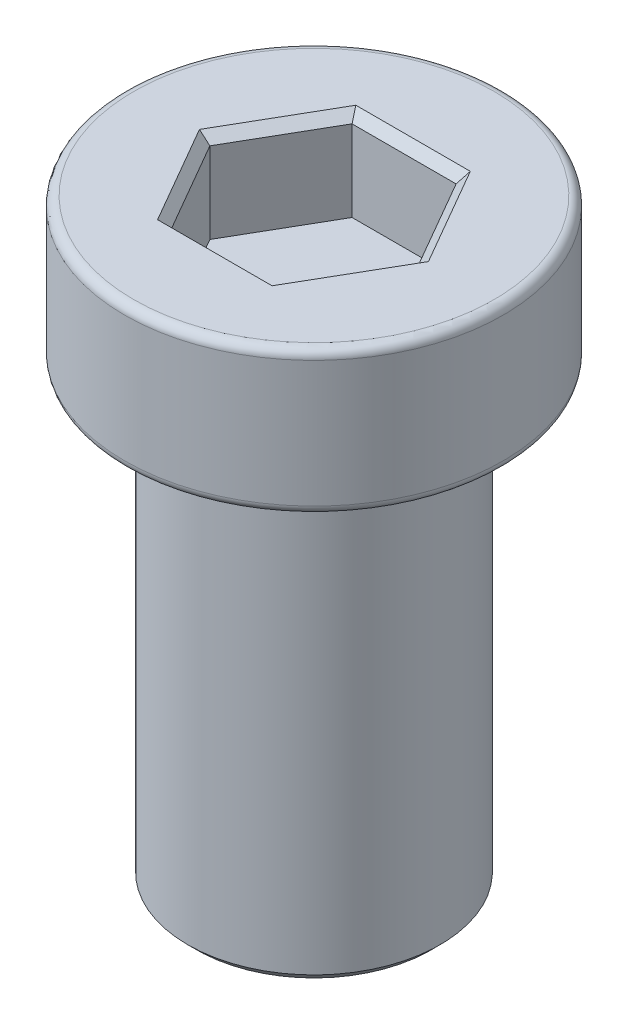
ISO-10303-21;
HEADER;
FILE_DESCRIPTION(('STEP AP214'),'2;1');
FILE_NAME('part.step','',(''),(''),'','','');
FILE_SCHEMA(('AUTOMOTIVE_DESIGN { 1 0 10303 214 1 1 1 1 }'));
ENDSEC;
DATA;
#1=APPLICATION_CONTEXT('core data for automotive mechanical design processes');
#2=APPLICATION_PROTOCOL_DEFINITION('international standard','automotive_design',2000,#1);
#3=PRODUCT_CONTEXT('',#1,'mechanical');
#4=PRODUCT('Part','Part','',(#3));
#5=PRODUCT_RELATED_PRODUCT_CATEGORY('part','',(#4));
#6=PRODUCT_DEFINITION_FORMATION('','',#4);
#7=PRODUCT_DEFINITION_CONTEXT('part definition',#1,'design');
#8=PRODUCT_DEFINITION('design','',#6,#7);
#9=PRODUCT_DEFINITION_SHAPE('','',#8);
#10=(LENGTH_UNIT() NAMED_UNIT(*) SI_UNIT(.MILLI.,.METRE.));
#11=(NAMED_UNIT(*) PLANE_ANGLE_UNIT() SI_UNIT($,.RADIAN.));
#12=(NAMED_UNIT(*) SI_UNIT($,.STERADIAN.) SOLID_ANGLE_UNIT());
#13=UNCERTAINTY_MEASURE_WITH_UNIT(LENGTH_MEASURE(1.E-05),#10,'distance_accuracy_value','');
#14=(GEOMETRIC_REPRESENTATION_CONTEXT(3) GLOBAL_UNCERTAINTY_ASSIGNED_CONTEXT((#13)) GLOBAL_UNIT_ASSIGNED_CONTEXT((#10,
#11,#12)) REPRESENTATION_CONTEXT('',''));
#15=CARTESIAN_POINT('',(0.,0.,0.));
#16=DIRECTION('',(0.,0.,1.));
#17=DIRECTION('',(1.,0.,0.));
#18=AXIS2_PLACEMENT_3D('',#15,#16,#17);
#19=CARTESIAN_POINT('',(0.,8.,0.));
#20=DIRECTION('',(0.,-1.,0.));
#21=DIRECTION('',(0.,0.,-1.));
#22=AXIS2_PLACEMENT_3D('',#19,#20,#21);
#23=CYLINDRICAL_SURFACE('',#22,10.5);
#24=CARTESIAN_POINT('',(0.,7.5,0.));
#25=DIRECTION('',(0.,1.,0.));
#26=DIRECTION('',(0.,0.,1.));
#27=AXIS2_PLACEMENT_3D('',#24,#25,#26);
#28=CIRCLE('',#27,10.5);
#29=CARTESIAN_POINT('',(0.,7.5,10.5));
#30=VERTEX_POINT('',#29);
#31=EDGE_CURVE('E176',#30,#30,#28,.F.);
#32=ORIENTED_EDGE('',*,*,#31,.T.);
#33=EDGE_LOOP('',(#32));
#34=FACE_BOUND('',#33,.T.);
#35=CARTESIAN_POINT('',(0.,0.5,0.));
#36=DIRECTION('',(0.,1.,0.));
#37=DIRECTION('',(0.,0.,1.));
#38=AXIS2_PLACEMENT_3D('',#35,#36,#37);
#39=CIRCLE('',#38,10.5);
#40=CARTESIAN_POINT('',(0.,0.5,10.5));
#41=VERTEX_POINT('',#40);
#42=EDGE_CURVE('E173',#41,#41,#39,.T.);
#43=ORIENTED_EDGE('',*,*,#42,.T.);
#44=EDGE_LOOP('',(#43));
#45=FACE_BOUND('',#44,.T.);
#46=ADVANCED_FACE('F43',(#34,#45),#23,.T.);
#47=CARTESIAN_POINT('',(0.,8.,0.));
#48=DIRECTION('',(0.,1.,0.));
#49=DIRECTION('',(0.,0.,1.));
#50=AXIS2_PLACEMENT_3D('',#47,#48,#49);
#51=PLANE('',#50);
#52=DIRECTION('',(0.5,0.,0.866025403784439));
#53=VECTOR('',#52,1.);
#54=CARTESIAN_POINT('',(6.20651539378847,8.,-0.25));
#55=LINE('',#54,#53);
#56=CARTESIAN_POINT('',(3.17542648054294,8.,-5.49999999999999));
#57=VERTEX_POINT('',#56);
#58=CARTESIAN_POINT('',(6.35085296108588,8.,0.));
#59=VERTEX_POINT('',#58);
#60=EDGE_CURVE('E187',#57,#59,#55,.T.);
#61=ORIENTED_EDGE('',*,*,#60,.T.);
#62=DIRECTION('',(-0.5,0.,0.866025403784439));
#63=VECTOR('',#62,1.);
#64=CARTESIAN_POINT('',(3.31976404784034,8.,5.25));
#65=LINE('',#64,#63);
#66=CARTESIAN_POINT('',(3.17542648054294,8.,5.49999999999999));
#67=VERTEX_POINT('',#66);
#68=EDGE_CURVE('E193',#59,#67,#65,.T.);
#69=ORIENTED_EDGE('',*,*,#68,.T.);
#70=DIRECTION('',(-1.,0.,0.));
#71=VECTOR('',#70,1.);
#72=CARTESIAN_POINT('',(-2.88675134594813,8.,5.49999999999999));
#73=LINE('',#72,#71);
#74=CARTESIAN_POINT('',(-3.17542648054294,8.,5.49999999999999));
#75=VERTEX_POINT('',#74);
#76=EDGE_CURVE('E191',#67,#75,#73,.T.);
#77=ORIENTED_EDGE('',*,*,#76,.T.);
#78=DIRECTION('',(-0.5,0.,-0.866025403784439));
#79=VECTOR('',#78,1.);
#80=CARTESIAN_POINT('',(-6.20651539378847,8.,0.249999999999998));
#81=LINE('',#80,#79);
#82=CARTESIAN_POINT('',(-6.35085296108588,8.,0.));
#83=VERTEX_POINT('',#82);
#84=EDGE_CURVE('E189',#75,#83,#81,.T.);
#85=ORIENTED_EDGE('',*,*,#84,.T.);
#86=DIRECTION('',(0.5,0.,-0.866025403784439));
#87=VECTOR('',#86,1.);
#88=CARTESIAN_POINT('',(-3.31976404784034,8.,-5.25));
#89=LINE('',#88,#87);
#90=CARTESIAN_POINT('',(-3.17542648054294,8.,-5.49999999999999));
#91=VERTEX_POINT('',#90);
#92=EDGE_CURVE('E183',#83,#91,#89,.T.);
#93=ORIENTED_EDGE('',*,*,#92,.T.);
#94=DIRECTION('',(1.,0.,0.));
#95=VECTOR('',#94,1.);
#96=CARTESIAN_POINT('',(2.88675134594813,8.,-5.49999999999999));
#97=LINE('',#96,#95);
#98=EDGE_CURVE('E185',#91,#57,#97,.T.);
#99=ORIENTED_EDGE('',*,*,#98,.T.);
#100=EDGE_LOOP('',(#61,#69,#77,#85,#93,#99));
#101=FACE_BOUND('',#100,.T.);
#102=CARTESIAN_POINT('',(0.,8.,0.));
#103=DIRECTION('',(0.,1.,0.));
#104=DIRECTION('',(0.,0.,1.));
#105=AXIS2_PLACEMENT_3D('',#102,#103,#104);
#106=CIRCLE('',#105,10.);
#107=CARTESIAN_POINT('',(0.,8.,10.));
#108=VERTEX_POINT('',#107);
#109=EDGE_CURVE('E170',#108,#108,#106,.T.);
#110=ORIENTED_EDGE('',*,*,#109,.T.);
#111=EDGE_LOOP('',(#110));
#112=FACE_BOUND('',#111,.T.);
#113=ADVANCED_FACE('F238',(#101,#112),#51,.T.);
#114=CARTESIAN_POINT('',(0.,0.,0.));
#115=DIRECTION('',(0.,1.,0.));
#116=DIRECTION('',(0.,0.,1.));
#117=AXIS2_PLACEMENT_3D('',#114,#115,#116);
#118=PLANE('',#117);
#119=CARTESIAN_POINT('',(0.,0.,0.));
#120=DIRECTION('',(0.,1.,0.));
#121=DIRECTION('',(0.,0.,1.));
#122=AXIS2_PLACEMENT_3D('',#119,#120,#121);
#123=CIRCLE('',#122,10.);
#124=CARTESIAN_POINT('',(0.,0.,10.));
#125=VERTEX_POINT('',#124);
#126=EDGE_CURVE('E179',#125,#125,#123,.F.);
#127=ORIENTED_EDGE('',*,*,#126,.T.);
#128=EDGE_LOOP('',(#127));
#129=FACE_BOUND('',#128,.T.);
#130=CARTESIAN_POINT('',(0.,0.,0.));
#131=DIRECTION('',(0.,-1.,0.));
#132=DIRECTION('',(0.,0.,-1.));
#133=AXIS2_PLACEMENT_3D('',#130,#131,#132);
#134=CIRCLE('',#133,7.);
#135=CARTESIAN_POINT('',(0.,0.,-7.));
#136=VERTEX_POINT('',#135);
#137=EDGE_CURVE('E152',#136,#136,#134,.T.);
#138=ORIENTED_EDGE('',*,*,#137,.F.);
#139=EDGE_LOOP('',(#138));
#140=FACE_BOUND('',#139,.T.);
#141=ADVANCED_FACE('F244',(#129,#140),#118,.F.);
#142=CARTESIAN_POINT('',(0.,-25.,0.));
#143=DIRECTION('',(0.,1.,0.));
#144=DIRECTION('',(0.,0.,1.));
#145=AXIS2_PLACEMENT_3D('',#142,#143,#144);
#146=CYLINDRICAL_SURFACE('',#145,7.);
#147=CARTESIAN_POINT('',(0.,-24.5,0.));
#148=DIRECTION('',(0.,-1.,0.));
#149=DIRECTION('',(0.,0.,-1.));
#150=AXIS2_PLACEMENT_3D('',#147,#148,#149);
#151=CIRCLE('',#150,7.);
#152=CARTESIAN_POINT('',(0.,-24.5,-7.));
#153=VERTEX_POINT('',#152);
#154=EDGE_CURVE('E167',#153,#153,#151,.F.);
#155=ORIENTED_EDGE('',*,*,#154,.T.);
#156=EDGE_LOOP('',(#155));
#157=FACE_BOUND('',#156,.T.);
#158=ORIENTED_EDGE('',*,*,#137,.T.);
#159=EDGE_LOOP('',(#158));
#160=FACE_BOUND('',#159,.T.);
#161=ADVANCED_FACE('F415',(#157,#160),#146,.T.);
#162=CARTESIAN_POINT('',(0.,-25.,0.));
#163=DIRECTION('',(0.,-1.,0.));
#164=DIRECTION('',(0.,0.,-1.));
#165=AXIS2_PLACEMENT_3D('',#162,#163,#164);
#166=PLANE('',#165);
#167=CARTESIAN_POINT('',(0.,-25.,0.));
#168=DIRECTION('',(0.,-1.,0.));
#169=DIRECTION('',(0.,0.,-1.));
#170=AXIS2_PLACEMENT_3D('',#167,#168,#169);
#171=CIRCLE('',#170,6.50000000000001);
#172=CARTESIAN_POINT('',(0.,-25.,-6.50000000000001));
#173=VERTEX_POINT('',#172);
#174=EDGE_CURVE('E164',#173,#173,#171,.T.);
#175=ORIENTED_EDGE('',*,*,#174,.T.);
#176=EDGE_LOOP('',(#175));
#177=FACE_BOUND('',#176,.T.);
#178=ADVANCED_FACE('F313',(#177),#166,.T.);
#179=CARTESIAN_POINT('',(2.88675134594813,3.,5.));
#180=DIRECTION('',(0.866025403784439,0.,0.5));
#181=DIRECTION('',(0.5,0.,-0.866025403784439));
#182=AXIS2_PLACEMENT_3D('',#179,#180,#181);
#183=PLANE('',#182);
#184=DIRECTION('',(0.,1.,0.));
#185=VECTOR('',#184,1.);
#186=CARTESIAN_POINT('',(2.88675134594813,3.,5.));
#187=LINE('',#186,#185);
#188=CARTESIAN_POINT('',(2.88675134594813,3.,5.));
#189=VERTEX_POINT('',#188);
#190=CARTESIAN_POINT('',(2.88675134594813,7.50000000000001,5.));
#191=VERTEX_POINT('',#190);
#192=EDGE_CURVE('E150',#189,#191,#187,.T.);
#193=ORIENTED_EDGE('',*,*,#192,.T.);
#194=DIRECTION('',(0.5,0.,-0.866025403784439));
#195=VECTOR('',#194,1.);
#196=CARTESIAN_POINT('',(5.77350269189626,7.50000000000001,0.));
#197=LINE('',#196,#195);
#198=CARTESIAN_POINT('',(5.77350269189626,7.50000000000001,0.));
#199=VERTEX_POINT('',#198);
#200=EDGE_CURVE('E124',#191,#199,#197,.T.);
#201=ORIENTED_EDGE('',*,*,#200,.T.);
#202=DIRECTION('',(0.,1.,0.));
#203=VECTOR('',#202,1.);
#204=CARTESIAN_POINT('',(5.77350269189626,3.,0.));
#205=LINE('',#204,#203);
#206=CARTESIAN_POINT('',(5.77350269189626,3.,0.));
#207=VERTEX_POINT('',#206);
#208=EDGE_CURVE('E116',#207,#199,#205,.T.);
#209=ORIENTED_EDGE('',*,*,#208,.F.);
#210=DIRECTION('',(0.5,0.,-0.866025403784439));
#211=VECTOR('',#210,1.);
#212=CARTESIAN_POINT('',(2.88675134594813,3.,5.));
#213=LINE('',#212,#211);
#214=EDGE_CURVE('E121',#189,#207,#213,.T.);
#215=ORIENTED_EDGE('',*,*,#214,.F.);
#216=EDGE_LOOP('',(#193,#201,#209,#215));
#217=FACE_BOUND('',#216,.T.);
#218=ADVANCED_FACE('F119',(#217),#183,.F.);
#219=CARTESIAN_POINT('',(-2.88675134594813,3.,5.));
#220=DIRECTION('',(0.,0.,1.));
#221=DIRECTION('',(1.,0.,0.));
#222=AXIS2_PLACEMENT_3D('',#219,#220,#221);
#223=PLANE('',#222);
#224=DIRECTION('',(0.,1.,0.));
#225=VECTOR('',#224,1.);
#226=CARTESIAN_POINT('',(-2.88675134594813,3.,5.));
#227=LINE('',#226,#225);
#228=CARTESIAN_POINT('',(-2.88675134594813,3.,5.));
#229=VERTEX_POINT('',#228);
#230=CARTESIAN_POINT('',(-2.88675134594813,7.50000000000001,5.));
#231=VERTEX_POINT('',#230);
#232=EDGE_CURVE('E153',#229,#231,#227,.T.);
#233=ORIENTED_EDGE('',*,*,#232,.T.);
#234=DIRECTION('',(1.,0.,0.));
#235=VECTOR('',#234,1.);
#236=CARTESIAN_POINT('',(2.88675134594813,7.50000000000001,5.));
#237=LINE('',#236,#235);
#238=EDGE_CURVE('E196',#231,#191,#237,.T.);
#239=ORIENTED_EDGE('',*,*,#238,.T.);
#240=ORIENTED_EDGE('',*,*,#192,.F.);
#241=DIRECTION('',(1.,0.,0.));
#242=VECTOR('',#241,1.);
#243=CARTESIAN_POINT('',(-2.88675134594813,3.,5.));
#244=LINE('',#243,#242);
#245=EDGE_CURVE('E126',#229,#189,#244,.T.);
#246=ORIENTED_EDGE('',*,*,#245,.F.);
#247=EDGE_LOOP('',(#233,#239,#240,#246));
#248=FACE_BOUND('',#247,.T.);
#249=ADVANCED_FACE('F305',(#248),#223,.F.);
#250=CARTESIAN_POINT('',(-5.77350269189626,3.,0.));
#251=DIRECTION('',(-0.866025403784439,0.,0.5));
#252=DIRECTION('',(0.5,0.,0.866025403784439));
#253=AXIS2_PLACEMENT_3D('',#250,#251,#252);
#254=PLANE('',#253);
#255=DIRECTION('',(0.,1.,0.));
#256=VECTOR('',#255,1.);
#257=CARTESIAN_POINT('',(-5.77350269189626,3.,0.));
#258=LINE('',#257,#256);
#259=CARTESIAN_POINT('',(-5.77350269189626,3.,0.));
#260=VERTEX_POINT('',#259);
#261=CARTESIAN_POINT('',(-5.77350269189626,7.50000000000001,0.));
#262=VERTEX_POINT('',#261);
#263=EDGE_CURVE('E156',#260,#262,#258,.T.);
#264=ORIENTED_EDGE('',*,*,#263,.T.);
#265=DIRECTION('',(0.5,0.,0.866025403784439));
#266=VECTOR('',#265,1.);
#267=CARTESIAN_POINT('',(-2.88675134594813,7.50000000000001,5.));
#268=LINE('',#267,#266);
#269=EDGE_CURVE('E198',#262,#231,#268,.T.);
#270=ORIENTED_EDGE('',*,*,#269,.T.);
#271=ORIENTED_EDGE('',*,*,#232,.F.);
#272=DIRECTION('',(0.5,0.,0.866025403784439));
#273=VECTOR('',#272,1.);
#274=CARTESIAN_POINT('',(-5.77350269189626,3.,0.));
#275=LINE('',#274,#273);
#276=EDGE_CURVE('E147',#260,#229,#275,.T.);
#277=ORIENTED_EDGE('',*,*,#276,.F.);
#278=EDGE_LOOP('',(#264,#270,#271,#277));
#279=FACE_BOUND('',#278,.T.);
#280=ADVANCED_FACE('F227',(#279),#254,.F.);
#281=CARTESIAN_POINT('',(-2.88675134594813,3.,-5.));
#282=DIRECTION('',(-0.866025403784439,0.,-0.5));
#283=DIRECTION('',(-0.5,0.,0.866025403784439));
#284=AXIS2_PLACEMENT_3D('',#281,#282,#283);
#285=PLANE('',#284);
#286=DIRECTION('',(0.,1.,0.));
#287=VECTOR('',#286,1.);
#288=CARTESIAN_POINT('',(-2.88675134594813,3.,-5.));
#289=LINE('',#288,#287);
#290=CARTESIAN_POINT('',(-2.88675134594813,3.,-5.));
#291=VERTEX_POINT('',#290);
#292=CARTESIAN_POINT('',(-2.88675134594813,7.50000000000001,-5.));
#293=VERTEX_POINT('',#292);
#294=EDGE_CURVE('E159',#291,#293,#289,.T.);
#295=ORIENTED_EDGE('',*,*,#294,.T.);
#296=DIRECTION('',(-0.5,0.,0.866025403784439));
#297=VECTOR('',#296,1.);
#298=CARTESIAN_POINT('',(-5.77350269189626,7.50000000000001,0.));
#299=LINE('',#298,#297);
#300=EDGE_CURVE('E11',#293,#262,#299,.T.);
#301=ORIENTED_EDGE('',*,*,#300,.T.);
#302=ORIENTED_EDGE('',*,*,#263,.F.);
#303=DIRECTION('',(-0.5,0.,0.866025403784439));
#304=VECTOR('',#303,1.);
#305=CARTESIAN_POINT('',(-2.88675134594813,3.,-5.));
#306=LINE('',#305,#304);
#307=EDGE_CURVE('E144',#291,#260,#306,.T.);
#308=ORIENTED_EDGE('',*,*,#307,.F.);
#309=EDGE_LOOP('',(#295,#301,#302,#308));
#310=FACE_BOUND('',#309,.T.);
#311=ADVANCED_FACE('F223',(#310),#285,.F.);
#312=CARTESIAN_POINT('',(2.88675134594813,3.,-5.));
#313=DIRECTION('',(0.,0.,-1.));
#314=DIRECTION('',(-1.,0.,0.));
#315=AXIS2_PLACEMENT_3D('',#312,#313,#314);
#316=PLANE('',#315);
#317=DIRECTION('',(0.,1.,0.));
#318=VECTOR('',#317,1.);
#319=CARTESIAN_POINT('',(2.88675134594813,3.,-5.));
#320=LINE('',#319,#318);
#321=CARTESIAN_POINT('',(2.88675134594813,3.,-5.));
#322=VERTEX_POINT('',#321);
#323=CARTESIAN_POINT('',(2.88675134594813,7.50000000000001,-5.));
#324=VERTEX_POINT('',#323);
#325=EDGE_CURVE('E125',#322,#324,#320,.T.);
#326=ORIENTED_EDGE('',*,*,#325,.T.);
#327=DIRECTION('',(-1.,0.,0.));
#328=VECTOR('',#327,1.);
#329=CARTESIAN_POINT('',(-2.88675134594813,7.50000000000001,-5.));
#330=LINE('',#329,#328);
#331=EDGE_CURVE('E53',#324,#293,#330,.T.);
#332=ORIENTED_EDGE('',*,*,#331,.T.);
#333=ORIENTED_EDGE('',*,*,#294,.F.);
#334=DIRECTION('',(-1.,0.,0.));
#335=VECTOR('',#334,1.);
#336=CARTESIAN_POINT('',(2.88675134594813,3.,-5.));
#337=LINE('',#336,#335);
#338=EDGE_CURVE('E134',#322,#291,#337,.T.);
#339=ORIENTED_EDGE('',*,*,#338,.F.);
#340=EDGE_LOOP('',(#326,#332,#333,#339));
#341=FACE_BOUND('',#340,.T.);
#342=ADVANCED_FACE('F228',(#341),#316,.F.);
#343=CARTESIAN_POINT('',(5.77350269189626,3.,0.));
#344=DIRECTION('',(0.866025403784438,0.,-0.5));
#345=DIRECTION('',(-0.5,0.,-0.866025403784439));
#346=AXIS2_PLACEMENT_3D('',#343,#344,#345);
#347=PLANE('',#346);
#348=ORIENTED_EDGE('',*,*,#208,.T.);
#349=DIRECTION('',(-0.5,0.,-0.866025403784439));
#350=VECTOR('',#349,1.);
#351=CARTESIAN_POINT('',(2.88675134594813,7.50000000000001,-5.));
#352=LINE('',#351,#350);
#353=EDGE_CURVE('E68',#199,#324,#352,.T.);
#354=ORIENTED_EDGE('',*,*,#353,.T.);
#355=ORIENTED_EDGE('',*,*,#325,.F.);
#356=DIRECTION('',(-0.5,0.,-0.866025403784439));
#357=VECTOR('',#356,1.);
#358=CARTESIAN_POINT('',(5.77350269189626,3.,0.));
#359=LINE('',#358,#357);
#360=EDGE_CURVE('E129',#207,#322,#359,.T.);
#361=ORIENTED_EDGE('',*,*,#360,.F.);
#362=EDGE_LOOP('',(#348,#354,#355,#361));
#363=FACE_BOUND('',#362,.T.);
#364=ADVANCED_FACE('F130',(#363),#347,.F.);
#365=CARTESIAN_POINT('',(0.,3.,0.));
#366=DIRECTION('',(0.,1.,0.));
#367=DIRECTION('',(0.,0.,1.));
#368=AXIS2_PLACEMENT_3D('',#365,#366,#367);
#369=PLANE('',#368);
#370=ORIENTED_EDGE('',*,*,#214,.T.);
#371=ORIENTED_EDGE('',*,*,#360,.T.);
#372=ORIENTED_EDGE('',*,*,#338,.T.);
#373=ORIENTED_EDGE('',*,*,#307,.T.);
#374=ORIENTED_EDGE('',*,*,#276,.T.);
#375=ORIENTED_EDGE('',*,*,#245,.T.);
#376=EDGE_LOOP('',(#370,#371,#372,#373,#374,#375));
#377=FACE_BOUND('',#376,.T.);
#378=ADVANCED_FACE('F136',(#377),#369,.T.);
#379=CARTESIAN_POINT('',(0.,-25.,0.));
#380=DIRECTION('',(0.,1.,0.));
#381=DIRECTION('',(0.,0.,1.));
#382=AXIS2_PLACEMENT_3D('',#379,#380,#381);
#383=CONICAL_SURFACE('',#382,6.50000000000001,0.785398163397446);
#384=ORIENTED_EDGE('',*,*,#154,.F.);
#385=EDGE_LOOP('',(#384));
#386=FACE_BOUND('',#385,.T.);
#387=ORIENTED_EDGE('',*,*,#174,.F.);
#388=EDGE_LOOP('',(#387));
#389=FACE_BOUND('',#388,.T.);
#390=ADVANCED_FACE('F251',(#386,#389),#383,.T.);
#391=CARTESIAN_POINT('',(0.,7.5,0.));
#392=DIRECTION('',(0.,1.,0.));
#393=DIRECTION('',(0.,0.,1.));
#394=AXIS2_PLACEMENT_3D('',#391,#392,#393);
#395=TOROIDAL_SURFACE('',#394,10.,0.5);
#396=ORIENTED_EDGE('',*,*,#31,.F.);
#397=EDGE_LOOP('',(#396));
#398=FACE_BOUND('',#397,.T.);
#399=ORIENTED_EDGE('',*,*,#109,.F.);
#400=EDGE_LOOP('',(#399));
#401=FACE_BOUND('',#400,.T.);
#402=ADVANCED_FACE('F256',(#398,#401),#395,.T.);
#403=CARTESIAN_POINT('',(0.,0.5,0.));
#404=DIRECTION('',(0.,1.,0.));
#405=DIRECTION('',(0.,0.,1.));
#406=AXIS2_PLACEMENT_3D('',#403,#404,#405);
#407=TOROIDAL_SURFACE('',#406,10.,0.5);
#408=ORIENTED_EDGE('',*,*,#126,.F.);
#409=EDGE_LOOP('',(#408));
#410=FACE_BOUND('',#409,.T.);
#411=ORIENTED_EDGE('',*,*,#42,.F.);
#412=EDGE_LOOP('',(#411));
#413=FACE_BOUND('',#412,.T.);
#414=ADVANCED_FACE('F260',(#410,#413),#407,.T.);
#415=CARTESIAN_POINT('',(-2.88675134594813,7.50000000000001,-5.));
#416=DIRECTION('',(0.61237243569579,0.707106781186553,0.353553390593271));
#417=DIRECTION('',(0.5,0.,-0.866025403784439));
#418=AXIS2_PLACEMENT_3D('',#415,#416,#417);
#419=PLANE('',#418);
#420=DIRECTION('',(-0.37796447300923,0.654653670707971,-0.654653670707982));
#421=VECTOR('',#420,1.);
#422=CARTESIAN_POINT('',(-2.0619652471058,6.07142857142859,-3.57142857142855));
#423=LINE('',#422,#421);
#424=EDGE_CURVE('E141',#91,#293,#423,.F.);
#425=ORIENTED_EDGE('',*,*,#424,.F.);
#426=ORIENTED_EDGE('',*,*,#92,.F.);
#427=DIRECTION('',(0.755928946018459,-0.654653670707972,0.));
#428=VECTOR('',#427,1.);
#429=CARTESIAN_POINT('',(-5.77350269189626,7.50000000000001,0.));
#430=LINE('',#429,#428);
#431=EDGE_CURVE('E48',#262,#83,#430,.F.);
#432=ORIENTED_EDGE('',*,*,#431,.F.);
#433=ORIENTED_EDGE('',*,*,#300,.F.);
#434=EDGE_LOOP('',(#425,#426,#432,#433));
#435=FACE_BOUND('',#434,.T.);
#436=ADVANCED_FACE('F46',(#435),#419,.T.);
#437=CARTESIAN_POINT('',(-5.77350269189626,7.50000000000001,0.));
#438=DIRECTION('',(0.61237243569579,0.707106781186553,-0.353553390593271));
#439=DIRECTION('',(-0.5,0.,-0.866025403784439));
#440=AXIS2_PLACEMENT_3D('',#437,#438,#439);
#441=PLANE('',#440);
#442=ORIENTED_EDGE('',*,*,#431,.T.);
#443=ORIENTED_EDGE('',*,*,#84,.F.);
#444=DIRECTION('',(0.37796447300923,-0.654653670707972,-0.654653670707982));
#445=VECTOR('',#444,1.);
#446=CARTESIAN_POINT('',(-2.88675134594813,7.50000000000001,5.));
#447=LINE('',#446,#445);
#448=EDGE_CURVE('E209',#231,#75,#447,.F.);
#449=ORIENTED_EDGE('',*,*,#448,.F.);
#450=ORIENTED_EDGE('',*,*,#269,.F.);
#451=EDGE_LOOP('',(#442,#443,#449,#450));
#452=FACE_BOUND('',#451,.T.);
#453=ADVANCED_FACE('F291',(#452),#441,.T.);
#454=CARTESIAN_POINT('',(2.88675134594813,7.50000000000001,-5.));
#455=DIRECTION('',(0.,0.707106781186553,0.707106781186542));
#456=DIRECTION('',(1.,0.,0.));
#457=AXIS2_PLACEMENT_3D('',#454,#455,#456);
#458=PLANE('',#457);
#459=ORIENTED_EDGE('',*,*,#424,.T.);
#460=ORIENTED_EDGE('',*,*,#331,.F.);
#461=DIRECTION('',(0.377964473009229,0.654653670707972,-0.654653670707982));
#462=VECTOR('',#461,1.);
#463=CARTESIAN_POINT('',(2.0619652471058,6.07142857142859,-3.57142857142855));
#464=LINE('',#463,#462);
#465=EDGE_CURVE('E206',#57,#324,#464,.F.);
#466=ORIENTED_EDGE('',*,*,#465,.F.);
#467=ORIENTED_EDGE('',*,*,#98,.F.);
#468=EDGE_LOOP('',(#459,#460,#466,#467));
#469=FACE_BOUND('',#468,.T.);
#470=ADVANCED_FACE('F215',(#469),#458,.T.);
#471=CARTESIAN_POINT('',(-2.88675134594813,7.50000000000001,5.));
#472=DIRECTION('',(0.,0.707106781186553,-0.707106781186542));
#473=DIRECTION('',(-1.,0.,0.));
#474=AXIS2_PLACEMENT_3D('',#471,#472,#473);
#475=PLANE('',#474);
#476=ORIENTED_EDGE('',*,*,#448,.T.);
#477=ORIENTED_EDGE('',*,*,#76,.F.);
#478=DIRECTION('',(-0.377964473009228,-0.654653670707972,-0.654653670707982));
#479=VECTOR('',#478,1.);
#480=CARTESIAN_POINT('',(2.88675134594813,7.50000000000001,5.));
#481=LINE('',#480,#479);
#482=EDGE_CURVE('E204',#191,#67,#481,.F.);
#483=ORIENTED_EDGE('',*,*,#482,.F.);
#484=ORIENTED_EDGE('',*,*,#238,.F.);
#485=EDGE_LOOP('',(#476,#477,#483,#484));
#486=FACE_BOUND('',#485,.T.);
#487=ADVANCED_FACE('F279',(#486),#475,.T.);
#488=CARTESIAN_POINT('',(5.77350269189626,7.50000000000001,0.));
#489=DIRECTION('',(-0.61237243569579,0.707106781186552,0.353553390593271));
#490=DIRECTION('',(0.5,0.,0.866025403784439));
#491=AXIS2_PLACEMENT_3D('',#488,#489,#490);
#492=PLANE('',#491);
#493=ORIENTED_EDGE('',*,*,#465,.T.);
#494=ORIENTED_EDGE('',*,*,#353,.F.);
#495=DIRECTION('',(0.755928946018459,0.654653670707972,0.));
#496=VECTOR('',#495,1.);
#497=CARTESIAN_POINT('',(4.12393049421159,6.07142857142859,0.));
#498=LINE('',#497,#496);
#499=EDGE_CURVE('E202',#59,#199,#498,.F.);
#500=ORIENTED_EDGE('',*,*,#499,.F.);
#501=ORIENTED_EDGE('',*,*,#60,.F.);
#502=EDGE_LOOP('',(#493,#494,#500,#501));
#503=FACE_BOUND('',#502,.T.);
#504=ADVANCED_FACE('F272',(#503),#492,.T.);
#505=CARTESIAN_POINT('',(2.88675134594813,7.50000000000001,5.));
#506=DIRECTION('',(-0.612372435695791,0.707106781186552,-0.353553390593271));
#507=DIRECTION('',(-0.5,0.,0.866025403784439));
#508=AXIS2_PLACEMENT_3D('',#505,#506,#507);
#509=PLANE('',#508);
#510=ORIENTED_EDGE('',*,*,#482,.T.);
#511=ORIENTED_EDGE('',*,*,#68,.F.);
#512=ORIENTED_EDGE('',*,*,#499,.T.);
#513=ORIENTED_EDGE('',*,*,#200,.F.);
#514=EDGE_LOOP('',(#510,#511,#512,#513));
#515=FACE_BOUND('',#514,.T.);
#516=ADVANCED_FACE('F266',(#515),#509,.T.);
#517=CLOSED_SHELL('',(#46,#113,#141,#161,#178,#218,#249,#280,#311,#342,#364,#378,#390,#402,#414,
#436,#453,#470,#487,#504,#516));
#518=MANIFOLD_SOLID_BREP('B2',#517);
#519=ADVANCED_BREP_SHAPE_REPRESENTATION('',(#18,#518),#14);
#520=SHAPE_DEFINITION_REPRESENTATION(#9,#519);
ENDSEC;
END-ISO-10303-21;
